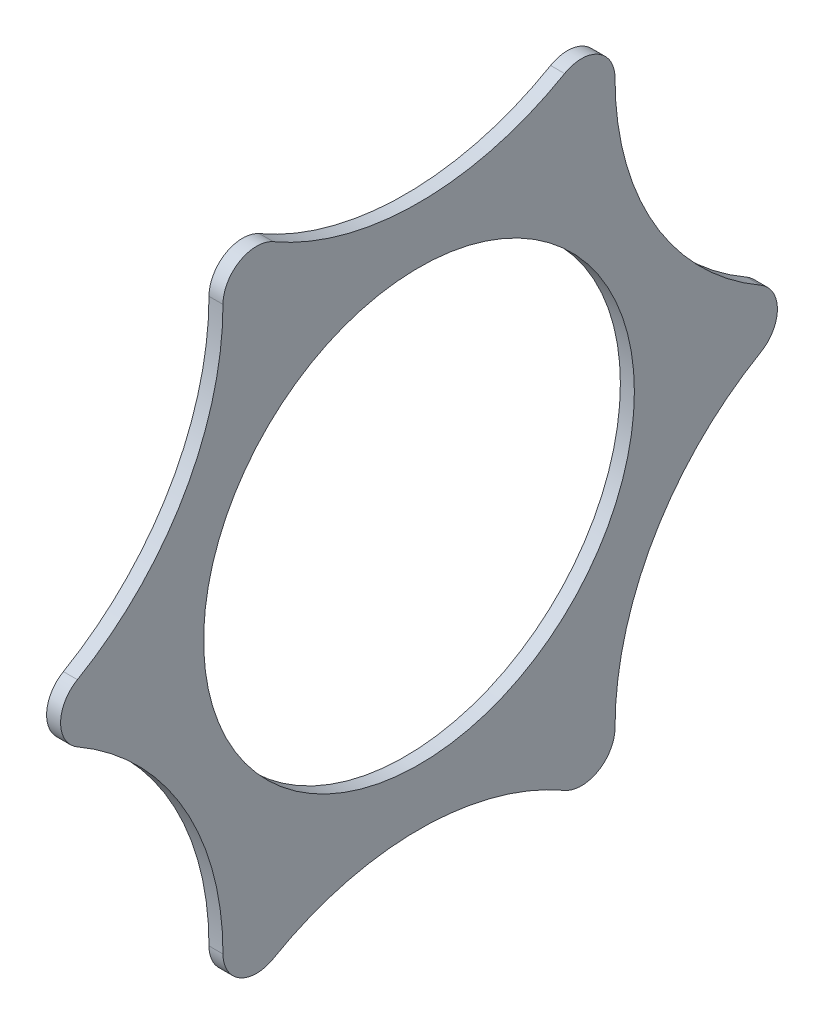
ISO-10303-21;
HEADER;
FILE_DESCRIPTION(('STEP AP214'),'2;1');
FILE_NAME('part.step','',(''),(''),'','','');
FILE_SCHEMA(('AUTOMOTIVE_DESIGN { 1 0 10303 214 1 1 1 1 }'));
ENDSEC;
DATA;
#1=APPLICATION_CONTEXT('core data for automotive mechanical design processes');
#2=APPLICATION_PROTOCOL_DEFINITION('international standard','automotive_design',2000,#1);
#3=PRODUCT_CONTEXT('',#1,'mechanical');
#4=PRODUCT('Part','Part','',(#3));
#5=PRODUCT_RELATED_PRODUCT_CATEGORY('part','',(#4));
#6=PRODUCT_DEFINITION_FORMATION('','',#4);
#7=PRODUCT_DEFINITION_CONTEXT('part definition',#1,'design');
#8=PRODUCT_DEFINITION('design','',#6,#7);
#9=PRODUCT_DEFINITION_SHAPE('','',#8);
#10=(LENGTH_UNIT() NAMED_UNIT(*) SI_UNIT(.MILLI.,.METRE.));
#11=(NAMED_UNIT(*) PLANE_ANGLE_UNIT() SI_UNIT($,.RADIAN.));
#12=(NAMED_UNIT(*) SI_UNIT($,.STERADIAN.) SOLID_ANGLE_UNIT());
#13=UNCERTAINTY_MEASURE_WITH_UNIT(LENGTH_MEASURE(1.E-05),#10,'distance_accuracy_value','');
#14=(GEOMETRIC_REPRESENTATION_CONTEXT(3) GLOBAL_UNCERTAINTY_ASSIGNED_CONTEXT((#13)) GLOBAL_UNIT_ASSIGNED_CONTEXT((#10,
#11,#12)) REPRESENTATION_CONTEXT('',''));
#15=CARTESIAN_POINT('',(0.,0.,0.));
#16=DIRECTION('',(0.,0.,1.));
#17=DIRECTION('',(1.,0.,0.));
#18=AXIS2_PLACEMENT_3D('',#15,#16,#17);
#19=CARTESIAN_POINT('',(78.616,-50.229473419497,86.9999999999992));
#20=DIRECTION('',(-1.,0.,0.));
#21=DIRECTION('',(0.,0.,1.));
#22=AXIS2_PLACEMENT_3D('',#19,#20,#21);
#23=CYLINDRICAL_SURFACE('',#22,51.9999999999992);
#24=DIRECTION('',(-1.,0.,0.));
#25=VECTOR('',#24,1.);
#26=CARTESIAN_POINT('',(78.616,-5.19615242270663,61.));
#27=LINE('',#26,#25);
#28=CARTESIAN_POINT('',(2.5,-5.19615242270663,61.));
#29=VERTEX_POINT('',#28);
#30=CARTESIAN_POINT('',(0.,-5.19615242270663,61.));
#31=VERTEX_POINT('',#30);
#32=EDGE_CURVE('E285',#29,#31,#27,.T.);
#33=ORIENTED_EDGE('',*,*,#32,.T.);
#34=CARTESIAN_POINT('',(0.,-50.229473419497,86.9999999999992));
#35=DIRECTION('',(-1.,0.,0.));
#36=DIRECTION('',(0.,0.,1.));
#37=AXIS2_PLACEMENT_3D('',#34,#35,#36);
#38=CIRCLE('',#37,51.9999999999992);
#39=CARTESIAN_POINT('',(0.,-50.2294734194974,35.));
#40=VERTEX_POINT('',#39);
#41=EDGE_CURVE('E246',#40,#31,#38,.F.);
#42=ORIENTED_EDGE('',*,*,#41,.F.);
#43=DIRECTION('',(-1.,0.,0.));
#44=VECTOR('',#43,1.);
#45=CARTESIAN_POINT('',(78.616,-50.2294734194974,35.));
#46=LINE('',#45,#44);
#47=CARTESIAN_POINT('',(2.5,-50.2294734194974,35.));
#48=VERTEX_POINT('',#47);
#49=EDGE_CURVE('E249',#48,#40,#46,.T.);
#50=ORIENTED_EDGE('',*,*,#49,.F.);
#51=CARTESIAN_POINT('',(2.5,-50.229473419497,86.9999999999992));
#52=DIRECTION('',(-1.,0.,0.));
#53=DIRECTION('',(0.,0.,1.));
#54=AXIS2_PLACEMENT_3D('',#51,#52,#53);
#55=CIRCLE('',#54,51.9999999999992);
#56=EDGE_CURVE('E12',#29,#48,#55,.T.);
#57=ORIENTED_EDGE('',*,*,#56,.F.);
#58=EDGE_LOOP('',(#33,#42,#50,#57));
#59=FACE_BOUND('',#58,.T.);
#60=ADVANCED_FACE('F169',(#59),#23,.F.);
#61=CARTESIAN_POINT('',(78.616,0.,58.));
#62=DIRECTION('',(-1.,0.,0.));
#63=DIRECTION('',(0.,0.,1.));
#64=AXIS2_PLACEMENT_3D('',#61,#62,#63);
#65=CYLINDRICAL_SURFACE('',#64,6.);
#66=CARTESIAN_POINT('',(2.5,0.,58.));
#67=DIRECTION('',(-1.,0.,0.));
#68=DIRECTION('',(0.,0.,1.));
#69=AXIS2_PLACEMENT_3D('',#66,#67,#68);
#70=CIRCLE('',#69,6.);
#71=CARTESIAN_POINT('',(2.5,5.19615242270665,61.));
#72=VERTEX_POINT('',#71);
#73=EDGE_CURVE('E180',#72,#29,#70,.F.);
#74=ORIENTED_EDGE('',*,*,#73,.F.);
#75=DIRECTION('',(-1.,0.,0.));
#76=VECTOR('',#75,1.);
#77=CARTESIAN_POINT('',(78.616,5.19615242270665,61.));
#78=LINE('',#77,#76);
#79=CARTESIAN_POINT('',(0.,5.19615242270665,61.));
#80=VERTEX_POINT('',#79);
#81=EDGE_CURVE('E277',#72,#80,#78,.T.);
#82=ORIENTED_EDGE('',*,*,#81,.T.);
#83=CARTESIAN_POINT('',(0.,0.,58.));
#84=DIRECTION('',(-1.,0.,0.));
#85=DIRECTION('',(0.,0.,1.));
#86=AXIS2_PLACEMENT_3D('',#83,#84,#85);
#87=CIRCLE('',#86,6.);
#88=EDGE_CURVE('E280',#31,#80,#87,.T.);
#89=ORIENTED_EDGE('',*,*,#88,.F.);
#90=ORIENTED_EDGE('',*,*,#32,.F.);
#91=EDGE_LOOP('',(#74,#82,#89,#90));
#92=FACE_BOUND('',#91,.T.);
#93=ADVANCED_FACE('F377',(#92),#65,.T.);
#94=CARTESIAN_POINT('',(78.616,50.2294734194971,86.9999999999994));
#95=DIRECTION('',(-1.,0.,0.));
#96=DIRECTION('',(0.,0.,1.));
#97=AXIS2_PLACEMENT_3D('',#94,#95,#96);
#98=CYLINDRICAL_SURFACE('',#97,51.9999999999994);
#99=DIRECTION('',(-1.,0.,0.));
#100=VECTOR('',#99,1.);
#101=CARTESIAN_POINT('',(78.616,50.2294734194971,35.));
#102=LINE('',#101,#100);
#103=CARTESIAN_POINT('',(2.5,50.2294734194971,35.));
#104=VERTEX_POINT('',#103);
#105=CARTESIAN_POINT('',(0.,50.2294734194971,35.));
#106=VERTEX_POINT('',#105);
#107=EDGE_CURVE('E282',#104,#106,#102,.T.);
#108=ORIENTED_EDGE('',*,*,#107,.T.);
#109=CARTESIAN_POINT('',(0.,50.2294734194971,86.9999999999994));
#110=DIRECTION('',(-1.,0.,0.));
#111=DIRECTION('',(0.,0.,1.));
#112=AXIS2_PLACEMENT_3D('',#109,#110,#111);
#113=CIRCLE('',#112,51.9999999999994);
#114=EDGE_CURVE('E273',#80,#106,#113,.F.);
#115=ORIENTED_EDGE('',*,*,#114,.F.);
#116=ORIENTED_EDGE('',*,*,#81,.F.);
#117=CARTESIAN_POINT('',(2.5,50.2294734194971,86.9999999999994));
#118=DIRECTION('',(-1.,0.,0.));
#119=DIRECTION('',(0.,0.,1.));
#120=AXIS2_PLACEMENT_3D('',#117,#118,#119);
#121=CIRCLE('',#120,51.9999999999994);
#122=EDGE_CURVE('E287',#104,#72,#121,.T.);
#123=ORIENTED_EDGE('',*,*,#122,.F.);
#124=EDGE_LOOP('',(#108,#115,#116,#123));
#125=FACE_BOUND('',#124,.T.);
#126=ADVANCED_FACE('F379',(#125),#98,.F.);
#127=CARTESIAN_POINT('',(78.616,50.2294734194975,29.));
#128=DIRECTION('',(-1.,0.,0.));
#129=DIRECTION('',(0.,0.,1.));
#130=AXIS2_PLACEMENT_3D('',#127,#128,#129);
#131=CYLINDRICAL_SURFACE('',#130,6.);
#132=DIRECTION('',(-1.,0.,0.));
#133=VECTOR('',#132,1.);
#134=CARTESIAN_POINT('',(78.616,55.4256258422041,26.));
#135=LINE('',#134,#133);
#136=CARTESIAN_POINT('',(2.5,55.4256258422041,26.));
#137=VERTEX_POINT('',#136);
#138=CARTESIAN_POINT('',(0.,55.4256258422041,26.));
#139=VERTEX_POINT('',#138);
#140=EDGE_CURVE('E283',#137,#139,#135,.T.);
#141=ORIENTED_EDGE('',*,*,#140,.T.);
#142=CARTESIAN_POINT('',(0.,50.2294734194975,29.));
#143=DIRECTION('',(-1.,0.,0.));
#144=DIRECTION('',(0.,0.,1.));
#145=AXIS2_PLACEMENT_3D('',#142,#143,#144);
#146=CIRCLE('',#145,6.);
#147=EDGE_CURVE('E276',#106,#139,#146,.T.);
#148=ORIENTED_EDGE('',*,*,#147,.F.);
#149=ORIENTED_EDGE('',*,*,#107,.F.);
#150=CARTESIAN_POINT('',(2.5,50.2294734194975,29.));
#151=DIRECTION('',(-1.,0.,0.));
#152=DIRECTION('',(0.,0.,1.));
#153=AXIS2_PLACEMENT_3D('',#150,#151,#152);
#154=CIRCLE('',#153,6.);
#155=EDGE_CURVE('E188',#137,#104,#154,.F.);
#156=ORIENTED_EDGE('',*,*,#155,.F.);
#157=EDGE_LOOP('',(#141,#148,#149,#156));
#158=FACE_BOUND('',#157,.T.);
#159=ADVANCED_FACE('F385',(#158),#131,.T.);
#160=CARTESIAN_POINT('',(78.616,100.458946838994,0.));
#161=DIRECTION('',(-1.,0.,0.));
#162=DIRECTION('',(0.,0.,1.));
#163=AXIS2_PLACEMENT_3D('',#160,#161,#162);
#164=CYLINDRICAL_SURFACE('',#163,51.9999999999992);
#165=DIRECTION('',(-1.,0.,0.));
#166=VECTOR('',#165,1.);
#167=CARTESIAN_POINT('',(78.616,55.4256258422041,-26.));
#168=LINE('',#167,#166);
#169=CARTESIAN_POINT('',(2.5,55.4256258422041,-26.));
#170=VERTEX_POINT('',#169);
#171=CARTESIAN_POINT('',(0.,55.4256258422041,-26.));
#172=VERTEX_POINT('',#171);
#173=EDGE_CURVE('E267',#170,#172,#168,.T.);
#174=ORIENTED_EDGE('',*,*,#173,.T.);
#175=CARTESIAN_POINT('',(0.,100.458946838994,0.));
#176=DIRECTION('',(-1.,0.,0.));
#177=DIRECTION('',(0.,0.,1.));
#178=AXIS2_PLACEMENT_3D('',#175,#176,#177);
#179=CIRCLE('',#178,51.9999999999992);
#180=EDGE_CURVE('E307',#139,#172,#179,.F.);
#181=ORIENTED_EDGE('',*,*,#180,.F.);
#182=ORIENTED_EDGE('',*,*,#140,.F.);
#183=CARTESIAN_POINT('',(2.5,100.458946838994,0.));
#184=DIRECTION('',(-1.,0.,0.));
#185=DIRECTION('',(0.,0.,1.));
#186=AXIS2_PLACEMENT_3D('',#183,#184,#185);
#187=CIRCLE('',#186,51.9999999999992);
#188=EDGE_CURVE('E302',#170,#137,#187,.T.);
#189=ORIENTED_EDGE('',*,*,#188,.F.);
#190=EDGE_LOOP('',(#174,#181,#182,#189));
#191=FACE_BOUND('',#190,.T.);
#192=ADVANCED_FACE('F387',(#191),#164,.F.);
#193=CARTESIAN_POINT('',(78.616,50.2294734194975,-29.));
#194=DIRECTION('',(-1.,0.,0.));
#195=DIRECTION('',(0.,0.,1.));
#196=AXIS2_PLACEMENT_3D('',#193,#194,#195);
#197=CYLINDRICAL_SURFACE('',#196,5.99999999999998);
#198=CARTESIAN_POINT('',(2.5,50.2294734194975,-29.));
#199=DIRECTION('',(-1.,0.,0.));
#200=DIRECTION('',(0.,0.,1.));
#201=AXIS2_PLACEMENT_3D('',#198,#199,#200);
#202=CIRCLE('',#201,5.99999999999998);
#203=CARTESIAN_POINT('',(2.5,50.229473419497,-35.));
#204=VERTEX_POINT('',#203);
#205=EDGE_CURVE('E256',#204,#170,#202,.F.);
#206=ORIENTED_EDGE('',*,*,#205,.F.);
#207=DIRECTION('',(-1.,0.,0.));
#208=VECTOR('',#207,1.);
#209=CARTESIAN_POINT('',(78.616,50.229473419497,-35.));
#210=LINE('',#209,#208);
#211=CARTESIAN_POINT('',(0.,50.229473419497,-35.));
#212=VERTEX_POINT('',#211);
#213=EDGE_CURVE('E262',#204,#212,#210,.T.);
#214=ORIENTED_EDGE('',*,*,#213,.T.);
#215=CARTESIAN_POINT('',(0.,50.2294734194975,-29.));
#216=DIRECTION('',(-1.,0.,0.));
#217=DIRECTION('',(0.,0.,1.));
#218=AXIS2_PLACEMENT_3D('',#215,#216,#217);
#219=CIRCLE('',#218,5.99999999999998);
#220=EDGE_CURVE('E264',#172,#212,#219,.T.);
#221=ORIENTED_EDGE('',*,*,#220,.F.);
#222=ORIENTED_EDGE('',*,*,#173,.F.);
#223=EDGE_LOOP('',(#206,#214,#221,#222));
#224=FACE_BOUND('',#223,.T.);
#225=ADVANCED_FACE('F389',(#224),#197,.T.);
#226=CARTESIAN_POINT('',(78.616,50.229473419497,-86.9999999999992));
#227=DIRECTION('',(-1.,0.,0.));
#228=DIRECTION('',(0.,0.,1.));
#229=AXIS2_PLACEMENT_3D('',#226,#227,#228);
#230=CYLINDRICAL_SURFACE('',#229,51.9999999999992);
#231=DIRECTION('',(-1.,0.,0.));
#232=VECTOR('',#231,1.);
#233=CARTESIAN_POINT('',(78.616,5.19615242270669,-61.));
#234=LINE('',#233,#232);
#235=CARTESIAN_POINT('',(2.5,5.19615242270669,-61.));
#236=VERTEX_POINT('',#235);
#237=CARTESIAN_POINT('',(0.,5.19615242270669,-61.));
#238=VERTEX_POINT('',#237);
#239=EDGE_CURVE('E268',#236,#238,#234,.T.);
#240=ORIENTED_EDGE('',*,*,#239,.T.);
#241=CARTESIAN_POINT('',(0.,50.229473419497,-86.9999999999992));
#242=DIRECTION('',(-1.,0.,0.));
#243=DIRECTION('',(0.,0.,1.));
#244=AXIS2_PLACEMENT_3D('',#241,#242,#243);
#245=CIRCLE('',#244,51.9999999999992);
#246=EDGE_CURVE('E259',#212,#238,#245,.F.);
#247=ORIENTED_EDGE('',*,*,#246,.F.);
#248=ORIENTED_EDGE('',*,*,#213,.F.);
#249=CARTESIAN_POINT('',(2.5,50.229473419497,-86.9999999999992));
#250=DIRECTION('',(-1.,0.,0.));
#251=DIRECTION('',(0.,0.,1.));
#252=AXIS2_PLACEMENT_3D('',#249,#250,#251);
#253=CIRCLE('',#252,51.9999999999992);
#254=EDGE_CURVE('E253',#236,#204,#253,.T.);
#255=ORIENTED_EDGE('',*,*,#254,.F.);
#256=EDGE_LOOP('',(#240,#247,#248,#255));
#257=FACE_BOUND('',#256,.T.);
#258=ADVANCED_FACE('F395',(#257),#230,.F.);
#259=CARTESIAN_POINT('',(78.616,0.,-58.));
#260=DIRECTION('',(-1.,0.,0.));
#261=DIRECTION('',(0.,0.,1.));
#262=AXIS2_PLACEMENT_3D('',#259,#260,#261);
#263=CYLINDRICAL_SURFACE('',#262,5.99999999999998);
#264=DIRECTION('',(-1.,0.,0.));
#265=VECTOR('',#264,1.);
#266=CARTESIAN_POINT('',(78.616,-5.19615242270658,-61.));
#267=LINE('',#266,#265);
#268=CARTESIAN_POINT('',(2.5,-5.19615242270658,-61.));
#269=VERTEX_POINT('',#268);
#270=CARTESIAN_POINT('',(0.,-5.19615242270658,-61.));
#271=VERTEX_POINT('',#270);
#272=EDGE_CURVE('E275',#269,#271,#267,.T.);
#273=ORIENTED_EDGE('',*,*,#272,.T.);
#274=CARTESIAN_POINT('',(0.,0.,-58.));
#275=DIRECTION('',(-1.,0.,0.));
#276=DIRECTION('',(0.,0.,1.));
#277=AXIS2_PLACEMENT_3D('',#274,#275,#276);
#278=CIRCLE('',#277,5.99999999999998);
#279=EDGE_CURVE('E261',#238,#271,#278,.T.);
#280=ORIENTED_EDGE('',*,*,#279,.F.);
#281=ORIENTED_EDGE('',*,*,#239,.F.);
#282=CARTESIAN_POINT('',(2.5,0.,-58.));
#283=DIRECTION('',(-1.,0.,0.));
#284=DIRECTION('',(0.,0.,1.));
#285=AXIS2_PLACEMENT_3D('',#282,#283,#284);
#286=CIRCLE('',#285,5.99999999999998);
#287=EDGE_CURVE('E260',#269,#236,#286,.F.);
#288=ORIENTED_EDGE('',*,*,#287,.F.);
#289=EDGE_LOOP('',(#273,#280,#281,#288));
#290=FACE_BOUND('',#289,.T.);
#291=ADVANCED_FACE('F400',(#290),#263,.T.);
#292=CARTESIAN_POINT('',(78.616,-50.2294734194969,-86.9999999999992));
#293=DIRECTION('',(-1.,0.,0.));
#294=DIRECTION('',(0.,0.,1.));
#295=AXIS2_PLACEMENT_3D('',#292,#293,#294);
#296=CYLINDRICAL_SURFACE('',#295,51.9999999999992);
#297=DIRECTION('',(-1.,0.,0.));
#298=VECTOR('',#297,1.);
#299=CARTESIAN_POINT('',(78.616,-50.2294734194974,-35.));
#300=LINE('',#299,#298);
#301=CARTESIAN_POINT('',(2.5,-50.2294734194974,-35.));
#302=VERTEX_POINT('',#301);
#303=CARTESIAN_POINT('',(0.,-50.2294734194974,-35.));
#304=VERTEX_POINT('',#303);
#305=EDGE_CURVE('E242',#302,#304,#300,.T.);
#306=ORIENTED_EDGE('',*,*,#305,.T.);
#307=CARTESIAN_POINT('',(0.,-50.2294734194969,-86.9999999999992));
#308=DIRECTION('',(-1.,0.,0.));
#309=DIRECTION('',(0.,0.,1.));
#310=AXIS2_PLACEMENT_3D('',#307,#308,#309);
#311=CIRCLE('',#310,51.9999999999992);
#312=EDGE_CURVE('E226',#271,#304,#311,.F.);
#313=ORIENTED_EDGE('',*,*,#312,.F.);
#314=ORIENTED_EDGE('',*,*,#272,.F.);
#315=CARTESIAN_POINT('',(2.5,-50.2294734194969,-86.9999999999992));
#316=DIRECTION('',(-1.,0.,0.));
#317=DIRECTION('',(0.,0.,1.));
#318=AXIS2_PLACEMENT_3D('',#315,#316,#317);
#319=CIRCLE('',#318,51.9999999999992);
#320=EDGE_CURVE('E289',#302,#269,#319,.T.);
#321=ORIENTED_EDGE('',*,*,#320,.F.);
#322=EDGE_LOOP('',(#306,#313,#314,#321));
#323=FACE_BOUND('',#322,.T.);
#324=ADVANCED_FACE('F402',(#323),#296,.F.);
#325=CARTESIAN_POINT('',(78.616,-50.2294734194974,-29.));
#326=DIRECTION('',(-1.,0.,0.));
#327=DIRECTION('',(0.,0.,1.));
#328=AXIS2_PLACEMENT_3D('',#325,#326,#327);
#329=CYLINDRICAL_SURFACE('',#328,5.99999999999998);
#330=CARTESIAN_POINT('',(2.5,-50.2294734194974,-29.));
#331=DIRECTION('',(-1.,0.,0.));
#332=DIRECTION('',(0.,0.,1.));
#333=AXIS2_PLACEMENT_3D('',#330,#331,#332);
#334=CIRCLE('',#333,5.99999999999998);
#335=CARTESIAN_POINT('',(2.5,-55.425625842204,-26.));
#336=VERTEX_POINT('',#335);
#337=EDGE_CURVE('E238',#336,#302,#334,.F.);
#338=ORIENTED_EDGE('',*,*,#337,.F.);
#339=DIRECTION('',(-1.,0.,0.));
#340=VECTOR('',#339,1.);
#341=CARTESIAN_POINT('',(78.616,-55.425625842204,-26.));
#342=LINE('',#341,#340);
#343=CARTESIAN_POINT('',(0.,-55.425625842204,-26.));
#344=VERTEX_POINT('',#343);
#345=EDGE_CURVE('E233',#336,#344,#342,.T.);
#346=ORIENTED_EDGE('',*,*,#345,.T.);
#347=CARTESIAN_POINT('',(0.,-50.2294734194974,-29.));
#348=DIRECTION('',(-1.,0.,0.));
#349=DIRECTION('',(0.,0.,1.));
#350=AXIS2_PLACEMENT_3D('',#347,#348,#349);
#351=CIRCLE('',#350,5.99999999999998);
#352=EDGE_CURVE('E222',#304,#344,#351,.T.);
#353=ORIENTED_EDGE('',*,*,#352,.F.);
#354=ORIENTED_EDGE('',*,*,#305,.F.);
#355=EDGE_LOOP('',(#338,#346,#353,#354));
#356=FACE_BOUND('',#355,.T.);
#357=ADVANCED_FACE('F237',(#356),#329,.T.);
#358=CARTESIAN_POINT('',(78.616,-100.458946838994,0.));
#359=DIRECTION('',(-1.,0.,0.));
#360=DIRECTION('',(0.,0.,1.));
#361=AXIS2_PLACEMENT_3D('',#358,#359,#360);
#362=CYLINDRICAL_SURFACE('',#361,51.9999999999992);
#363=DIRECTION('',(-1.,0.,0.));
#364=VECTOR('',#363,1.);
#365=CARTESIAN_POINT('',(78.616,-55.425625842204,26.));
#366=LINE('',#365,#364);
#367=CARTESIAN_POINT('',(2.5,-55.425625842204,26.));
#368=VERTEX_POINT('',#367);
#369=CARTESIAN_POINT('',(0.,-55.425625842204,26.));
#370=VERTEX_POINT('',#369);
#371=EDGE_CURVE('E244',#368,#370,#366,.T.);
#372=ORIENTED_EDGE('',*,*,#371,.T.);
#373=CARTESIAN_POINT('',(0.,-100.458946838994,0.));
#374=DIRECTION('',(-1.,0.,0.));
#375=DIRECTION('',(0.,0.,1.));
#376=AXIS2_PLACEMENT_3D('',#373,#374,#375);
#377=CIRCLE('',#376,51.9999999999992);
#378=EDGE_CURVE('E227',#344,#370,#377,.F.);
#379=ORIENTED_EDGE('',*,*,#378,.F.);
#380=ORIENTED_EDGE('',*,*,#345,.F.);
#381=CARTESIAN_POINT('',(2.5,-100.458946838994,0.));
#382=DIRECTION('',(-1.,0.,0.));
#383=DIRECTION('',(0.,0.,1.));
#384=AXIS2_PLACEMENT_3D('',#381,#382,#383);
#385=CIRCLE('',#384,51.9999999999992);
#386=EDGE_CURVE('E172',#368,#336,#385,.T.);
#387=ORIENTED_EDGE('',*,*,#386,.F.);
#388=EDGE_LOOP('',(#372,#379,#380,#387));
#389=FACE_BOUND('',#388,.T.);
#390=ADVANCED_FACE('F170',(#389),#362,.F.);
#391=CARTESIAN_POINT('',(78.616,-50.2294734194974,29.));
#392=DIRECTION('',(-1.,0.,0.));
#393=DIRECTION('',(0.,0.,1.));
#394=AXIS2_PLACEMENT_3D('',#391,#392,#393);
#395=CYLINDRICAL_SURFACE('',#394,5.99999999999998);
#396=ORIENTED_EDGE('',*,*,#49,.T.);
#397=CARTESIAN_POINT('',(0.,-50.2294734194974,29.));
#398=DIRECTION('',(-1.,0.,0.));
#399=DIRECTION('',(0.,0.,1.));
#400=AXIS2_PLACEMENT_3D('',#397,#398,#399);
#401=CIRCLE('',#400,5.99999999999998);
#402=EDGE_CURVE('E250',#370,#40,#401,.T.);
#403=ORIENTED_EDGE('',*,*,#402,.F.);
#404=ORIENTED_EDGE('',*,*,#371,.F.);
#405=CARTESIAN_POINT('',(2.5,-50.2294734194974,29.));
#406=DIRECTION('',(-1.,0.,0.));
#407=DIRECTION('',(0.,0.,1.));
#408=AXIS2_PLACEMENT_3D('',#405,#406,#407);
#409=CIRCLE('',#408,5.99999999999998);
#410=EDGE_CURVE('E235',#48,#368,#409,.F.);
#411=ORIENTED_EDGE('',*,*,#410,.F.);
#412=EDGE_LOOP('',(#396,#403,#404,#411));
#413=FACE_BOUND('',#412,.T.);
#414=ADVANCED_FACE('F344',(#413),#395,.T.);
#415=CARTESIAN_POINT('',(0.,29.5,0.));
#416=DIRECTION('',(1.,0.,0.));
#417=DIRECTION('',(0.,0.,-1.));
#418=AXIS2_PLACEMENT_3D('',#415,#416,#417);
#419=PLANE('',#418);
#420=CARTESIAN_POINT('',(0.,0.,0.));
#421=DIRECTION('',(1.,0.,0.));
#422=DIRECTION('',(0.,0.,-1.));
#423=AXIS2_PLACEMENT_3D('',#420,#421,#422);
#424=CIRCLE('',#423,38.4589468389948);
#425=CARTESIAN_POINT('',(0.,0.,-38.4589468389948));
#426=VERTEX_POINT('',#425);
#427=EDGE_CURVE('E324',#426,#426,#424,.T.);
#428=ORIENTED_EDGE('',*,*,#427,.T.);
#429=EDGE_LOOP('',(#428));
#430=FACE_BOUND('',#429,.T.);
#431=ORIENTED_EDGE('',*,*,#378,.T.);
#432=ORIENTED_EDGE('',*,*,#402,.T.);
#433=ORIENTED_EDGE('',*,*,#41,.T.);
#434=ORIENTED_EDGE('',*,*,#88,.T.);
#435=ORIENTED_EDGE('',*,*,#114,.T.);
#436=ORIENTED_EDGE('',*,*,#147,.T.);
#437=ORIENTED_EDGE('',*,*,#180,.T.);
#438=ORIENTED_EDGE('',*,*,#220,.T.);
#439=ORIENTED_EDGE('',*,*,#246,.T.);
#440=ORIENTED_EDGE('',*,*,#279,.T.);
#441=ORIENTED_EDGE('',*,*,#312,.T.);
#442=ORIENTED_EDGE('',*,*,#352,.T.);
#443=EDGE_LOOP('',(#431,#432,#433,#434,#435,#436,#437,#438,#439,#440,#441,#442));
#444=FACE_BOUND('',#443,.T.);
#445=ADVANCED_FACE('F224',(#430,#444),#419,.F.);
#446=CARTESIAN_POINT('',(2.5,64.,0.));
#447=DIRECTION('',(-1.,0.,0.));
#448=DIRECTION('',(0.,0.,1.));
#449=AXIS2_PLACEMENT_3D('',#446,#447,#448);
#450=PLANE('',#449);
#451=CARTESIAN_POINT('',(2.5,0.,0.));
#452=DIRECTION('',(1.,0.,0.));
#453=DIRECTION('',(0.,0.,-1.));
#454=AXIS2_PLACEMENT_3D('',#451,#452,#453);
#455=CIRCLE('',#454,38.4589468389948);
#456=CARTESIAN_POINT('',(2.5,0.,-38.4589468389948));
#457=VERTEX_POINT('',#456);
#458=EDGE_CURVE('E321',#457,#457,#455,.T.);
#459=ORIENTED_EDGE('',*,*,#458,.F.);
#460=EDGE_LOOP('',(#459));
#461=FACE_BOUND('',#460,.T.);
#462=ORIENTED_EDGE('',*,*,#410,.T.);
#463=ORIENTED_EDGE('',*,*,#386,.T.);
#464=ORIENTED_EDGE('',*,*,#337,.T.);
#465=ORIENTED_EDGE('',*,*,#320,.T.);
#466=ORIENTED_EDGE('',*,*,#287,.T.);
#467=ORIENTED_EDGE('',*,*,#254,.T.);
#468=ORIENTED_EDGE('',*,*,#205,.T.);
#469=ORIENTED_EDGE('',*,*,#188,.T.);
#470=ORIENTED_EDGE('',*,*,#155,.T.);
#471=ORIENTED_EDGE('',*,*,#122,.T.);
#472=ORIENTED_EDGE('',*,*,#73,.T.);
#473=ORIENTED_EDGE('',*,*,#56,.T.);
#474=EDGE_LOOP('',(#462,#463,#464,#465,#466,#467,#468,#469,#470,#471,#472,#473));
#475=FACE_BOUND('',#474,.T.);
#476=ADVANCED_FACE('F335',(#461,#475),#450,.F.);
#477=CARTESIAN_POINT('',(0.,0.,0.));
#478=DIRECTION('',(1.,0.,0.));
#479=DIRECTION('',(0.,0.,-1.));
#480=AXIS2_PLACEMENT_3D('',#477,#478,#479);
#481=CYLINDRICAL_SURFACE('',#480,38.4589468389948);
#482=ORIENTED_EDGE('',*,*,#427,.F.);
#483=EDGE_LOOP('',(#482));
#484=FACE_BOUND('',#483,.T.);
#485=ORIENTED_EDGE('',*,*,#458,.T.);
#486=EDGE_LOOP('',(#485));
#487=FACE_BOUND('',#486,.T.);
#488=ADVANCED_FACE('F333',(#484,#487),#481,.F.);
#489=CLOSED_SHELL('',(#60,#93,#126,#159,#192,#225,#258,#291,#324,#357,#390,#414,#445,#476,#488));
#490=MANIFOLD_SOLID_BREP('B2',#489);
#491=ADVANCED_BREP_SHAPE_REPRESENTATION('',(#18,#490),#14);
#492=SHAPE_DEFINITION_REPRESENTATION(#9,#491);
ENDSEC;
END-ISO-10303-21;
